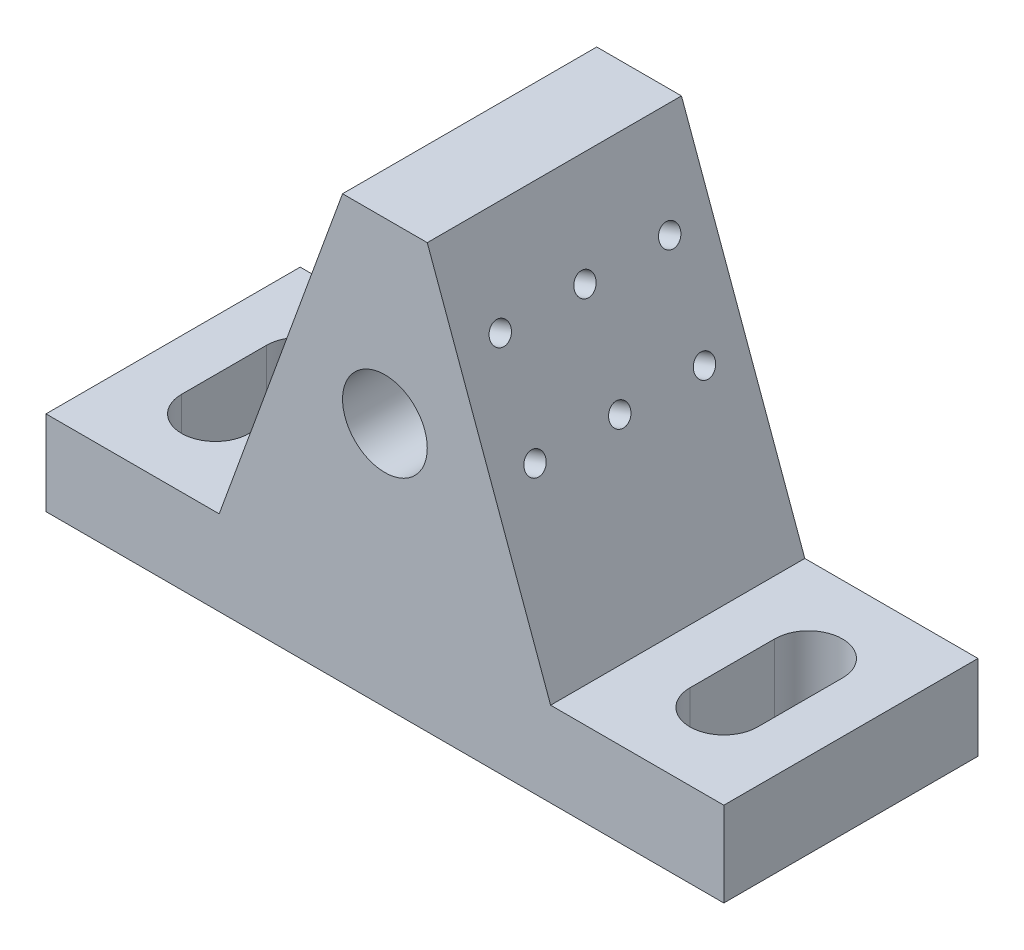
ISO-10303-21;
HEADER;
FILE_DESCRIPTION(('STEP AP214'),'2;1');
FILE_NAME('part.step','',(''),(''),'','','');
FILE_SCHEMA(('AUTOMOTIVE_DESIGN { 1 0 10303 214 1 1 1 1 }'));
ENDSEC;
DATA;
#1=APPLICATION_CONTEXT('core data for automotive mechanical design processes');
#2=APPLICATION_PROTOCOL_DEFINITION('international standard','automotive_design',2000,#1);
#3=PRODUCT_CONTEXT('',#1,'mechanical');
#4=PRODUCT('Part','Part','',(#3));
#5=PRODUCT_RELATED_PRODUCT_CATEGORY('part','',(#4));
#6=PRODUCT_DEFINITION_FORMATION('','',#4);
#7=PRODUCT_DEFINITION_CONTEXT('part definition',#1,'design');
#8=PRODUCT_DEFINITION('design','',#6,#7);
#9=PRODUCT_DEFINITION_SHAPE('','',#8);
#10=(LENGTH_UNIT() NAMED_UNIT(*) SI_UNIT(.MILLI.,.METRE.));
#11=(NAMED_UNIT(*) PLANE_ANGLE_UNIT() SI_UNIT($,.RADIAN.));
#12=(NAMED_UNIT(*) SI_UNIT($,.STERADIAN.) SOLID_ANGLE_UNIT());
#13=UNCERTAINTY_MEASURE_WITH_UNIT(LENGTH_MEASURE(1.E-05),#10,'distance_accuracy_value','');
#14=(GEOMETRIC_REPRESENTATION_CONTEXT(3) GLOBAL_UNCERTAINTY_ASSIGNED_CONTEXT((#13)) GLOBAL_UNIT_ASSIGNED_CONTEXT((#10,
#11,#12)) REPRESENTATION_CONTEXT('',''));
#15=CARTESIAN_POINT('',(0.,0.,0.));
#16=DIRECTION('',(0.,0.,1.));
#17=DIRECTION('',(1.,0.,0.));
#18=AXIS2_PLACEMENT_3D('',#15,#16,#17);
#19=CARTESIAN_POINT('',(40.,10.,15.));
#20=DIRECTION('',(0.,-1.,0.));
#21=DIRECTION('',(1.,0.,0.));
#22=AXIS2_PLACEMENT_3D('',#19,#20,#21);
#23=PLANE('',#22);
#24=DIRECTION('',(-1.,0.,0.));
#25=VECTOR('',#24,1.);
#26=CARTESIAN_POINT('',(40.,10.,-15.));
#27=LINE('',#26,#25);
#28=CARTESIAN_POINT('',(40.,10.,-15.));
#29=VERTEX_POINT('',#28);
#30=CARTESIAN_POINT('',(19.558809370648,10.,-15.));
#31=VERTEX_POINT('',#30);
#32=EDGE_CURVE('E290',#29,#31,#27,.T.);
#33=ORIENTED_EDGE('',*,*,#32,.T.);
#34=DIRECTION('',(0.,0.,-1.));
#35=VECTOR('',#34,1.);
#36=CARTESIAN_POINT('',(19.558809370648,10.,15.));
#37=LINE('',#36,#35);
#38=CARTESIAN_POINT('',(19.558809370648,10.,15.));
#39=VERTEX_POINT('',#38);
#40=EDGE_CURVE('E320',#39,#31,#37,.T.);
#41=ORIENTED_EDGE('',*,*,#40,.F.);
#42=DIRECTION('',(-1.,0.,0.));
#43=VECTOR('',#42,1.);
#44=CARTESIAN_POINT('',(40.,10.,15.));
#45=LINE('',#44,#43);
#46=CARTESIAN_POINT('',(40.,10.,15.));
#47=VERTEX_POINT('',#46);
#48=EDGE_CURVE('E272',#47,#39,#45,.T.);
#49=ORIENTED_EDGE('',*,*,#48,.F.);
#50=DIRECTION('',(0.,0.,-1.));
#51=VECTOR('',#50,1.);
#52=CARTESIAN_POINT('',(40.,10.,15.));
#53=LINE('',#52,#51);
#54=EDGE_CURVE('E323',#47,#29,#53,.T.);
#55=ORIENTED_EDGE('',*,*,#54,.T.);
#56=EDGE_LOOP('',(#33,#41,#49,#55));
#57=FACE_BOUND('',#56,.T.);
#58=CARTESIAN_POINT('',(30.,10.,5.));
#59=DIRECTION('',(0.,-1.,0.));
#60=DIRECTION('',(1.,0.,0.));
#61=AXIS2_PLACEMENT_3D('',#58,#59,#60);
#62=CIRCLE('',#61,4.);
#63=CARTESIAN_POINT('',(26.,9.99999999999999,5.));
#64=VERTEX_POINT('',#63);
#65=CARTESIAN_POINT('',(34.,10.,5.));
#66=VERTEX_POINT('',#65);
#67=EDGE_CURVE('E266',#64,#66,#62,.F.);
#68=ORIENTED_EDGE('',*,*,#67,.F.);
#69=DIRECTION('',(0.,0.,1.));
#70=VECTOR('',#69,1.);
#71=CARTESIAN_POINT('',(26.,10.,15.));
#72=LINE('',#71,#70);
#73=CARTESIAN_POINT('',(26.,10.,-5.));
#74=VERTEX_POINT('',#73);
#75=EDGE_CURVE('E259',#74,#64,#72,.T.);
#76=ORIENTED_EDGE('',*,*,#75,.F.);
#77=CARTESIAN_POINT('',(30.,10.,-5.));
#78=DIRECTION('',(0.,-1.,0.));
#79=DIRECTION('',(1.,0.,0.));
#80=AXIS2_PLACEMENT_3D('',#77,#78,#79);
#81=CIRCLE('',#80,4.);
#82=CARTESIAN_POINT('',(34.,10.,-5.));
#83=VERTEX_POINT('',#82);
#84=EDGE_CURVE('E261',#83,#74,#81,.F.);
#85=ORIENTED_EDGE('',*,*,#84,.F.);
#86=DIRECTION('',(0.,0.,-1.));
#87=VECTOR('',#86,1.);
#88=CARTESIAN_POINT('',(34.,10.,15.));
#89=LINE('',#88,#87);
#90=EDGE_CURVE('E264',#66,#83,#89,.T.);
#91=ORIENTED_EDGE('',*,*,#90,.F.);
#92=EDGE_LOOP('',(#68,#76,#85,#91));
#93=FACE_BOUND('',#92,.T.);
#94=ADVANCED_FACE('F41',(#57,#93),#23,.F.);
#95=CARTESIAN_POINT('',(-40.,0.,15.));
#96=DIRECTION('',(0.,1.,0.));
#97=DIRECTION('',(0.,0.,1.));
#98=AXIS2_PLACEMENT_3D('',#95,#96,#97);
#99=PLANE('',#98);
#100=DIRECTION('',(0.,0.,-1.));
#101=VECTOR('',#100,1.);
#102=CARTESIAN_POINT('',(-34.,0.,5.));
#103=LINE('',#102,#101);
#104=CARTESIAN_POINT('',(-34.,0.,5.));
#105=VERTEX_POINT('',#104);
#106=CARTESIAN_POINT('',(-34.,0.,-5.));
#107=VERTEX_POINT('',#106);
#108=EDGE_CURVE('E229',#105,#107,#103,.T.);
#109=ORIENTED_EDGE('',*,*,#108,.F.);
#110=CARTESIAN_POINT('',(-30.,0.,5.));
#111=DIRECTION('',(0.,-1.,0.));
#112=DIRECTION('',(0.,0.,1.));
#113=AXIS2_PLACEMENT_3D('',#110,#111,#112);
#114=CIRCLE('',#113,4.);
#115=CARTESIAN_POINT('',(-26.,0.,5.));
#116=VERTEX_POINT('',#115);
#117=EDGE_CURVE('E56',#116,#105,#114,.T.);
#118=ORIENTED_EDGE('',*,*,#117,.F.);
#119=DIRECTION('',(0.,0.,1.));
#120=VECTOR('',#119,1.);
#121=CARTESIAN_POINT('',(-26.,0.,5.));
#122=LINE('',#121,#120);
#123=CARTESIAN_POINT('',(-26.,0.,-5.));
#124=VERTEX_POINT('',#123);
#125=EDGE_CURVE('E223',#124,#116,#122,.T.);
#126=ORIENTED_EDGE('',*,*,#125,.F.);
#127=CARTESIAN_POINT('',(-30.,0.,-5.));
#128=DIRECTION('',(0.,-1.,0.));
#129=DIRECTION('',(0.,0.,1.));
#130=AXIS2_PLACEMENT_3D('',#127,#128,#129);
#131=CIRCLE('',#130,4.);
#132=EDGE_CURVE('E226',#107,#124,#131,.T.);
#133=ORIENTED_EDGE('',*,*,#132,.F.);
#134=EDGE_LOOP('',(#109,#118,#126,#133));
#135=FACE_BOUND('',#134,.T.);
#136=DIRECTION('',(1.,0.,0.));
#137=VECTOR('',#136,1.);
#138=CARTESIAN_POINT('',(-40.,0.,-15.));
#139=LINE('',#138,#137);
#140=CARTESIAN_POINT('',(-40.,0.,-15.));
#141=VERTEX_POINT('',#140);
#142=CARTESIAN_POINT('',(40.,0.,-15.));
#143=VERTEX_POINT('',#142);
#144=EDGE_CURVE('E273',#141,#143,#139,.T.);
#145=ORIENTED_EDGE('',*,*,#144,.T.);
#146=DIRECTION('',(0.,0.,-1.));
#147=VECTOR('',#146,1.);
#148=CARTESIAN_POINT('',(40.,0.,15.));
#149=LINE('',#148,#147);
#150=CARTESIAN_POINT('',(40.,0.,15.));
#151=VERTEX_POINT('',#150);
#152=EDGE_CURVE('E287',#151,#143,#149,.T.);
#153=ORIENTED_EDGE('',*,*,#152,.F.);
#154=DIRECTION('',(1.,0.,0.));
#155=VECTOR('',#154,1.);
#156=CARTESIAN_POINT('',(-40.,0.,15.));
#157=LINE('',#156,#155);
#158=CARTESIAN_POINT('',(-40.,0.,15.));
#159=VERTEX_POINT('',#158);
#160=EDGE_CURVE('E285',#159,#151,#157,.T.);
#161=ORIENTED_EDGE('',*,*,#160,.F.);
#162=DIRECTION('',(0.,0.,-1.));
#163=VECTOR('',#162,1.);
#164=CARTESIAN_POINT('',(-40.,0.,15.));
#165=LINE('',#164,#163);
#166=EDGE_CURVE('E305',#159,#141,#165,.T.);
#167=ORIENTED_EDGE('',*,*,#166,.T.);
#168=EDGE_LOOP('',(#145,#153,#161,#167));
#169=FACE_BOUND('',#168,.T.);
#170=CARTESIAN_POINT('',(30.,0.,5.));
#171=DIRECTION('',(0.,1.,0.));
#172=DIRECTION('',(0.,0.,1.));
#173=AXIS2_PLACEMENT_3D('',#170,#171,#172);
#174=CIRCLE('',#173,4.);
#175=CARTESIAN_POINT('',(26.,0.,5.));
#176=VERTEX_POINT('',#175);
#177=CARTESIAN_POINT('',(34.,0.,5.));
#178=VERTEX_POINT('',#177);
#179=EDGE_CURVE('E238',#176,#178,#174,.T.);
#180=ORIENTED_EDGE('',*,*,#179,.T.);
#181=DIRECTION('',(0.,0.,-1.));
#182=VECTOR('',#181,1.);
#183=CARTESIAN_POINT('',(34.,0.,5.));
#184=LINE('',#183,#182);
#185=CARTESIAN_POINT('',(34.,0.,-5.));
#186=VERTEX_POINT('',#185);
#187=EDGE_CURVE('E241',#178,#186,#184,.T.);
#188=ORIENTED_EDGE('',*,*,#187,.T.);
#189=CARTESIAN_POINT('',(30.,0.,-5.));
#190=DIRECTION('',(0.,1.,0.));
#191=DIRECTION('',(0.,0.,1.));
#192=AXIS2_PLACEMENT_3D('',#189,#190,#191);
#193=CIRCLE('',#192,4.);
#194=CARTESIAN_POINT('',(26.,0.,-5.));
#195=VERTEX_POINT('',#194);
#196=EDGE_CURVE('E244',#186,#195,#193,.T.);
#197=ORIENTED_EDGE('',*,*,#196,.T.);
#198=DIRECTION('',(0.,0.,1.));
#199=VECTOR('',#198,1.);
#200=CARTESIAN_POINT('',(26.,0.,5.));
#201=LINE('',#200,#199);
#202=EDGE_CURVE('E247',#195,#176,#201,.T.);
#203=ORIENTED_EDGE('',*,*,#202,.T.);
#204=EDGE_LOOP('',(#180,#188,#197,#203));
#205=FACE_BOUND('',#204,.T.);
#206=ADVANCED_FACE('F345',(#135,#169,#205),#99,.F.);
#207=CARTESIAN_POINT('',(40.,0.,15.));
#208=DIRECTION('',(-1.,0.,0.));
#209=DIRECTION('',(0.,0.,1.));
#210=AXIS2_PLACEMENT_3D('',#207,#208,#209);
#211=PLANE('',#210);
#212=DIRECTION('',(0.,1.,0.));
#213=VECTOR('',#212,1.);
#214=CARTESIAN_POINT('',(40.,0.,-15.));
#215=LINE('',#214,#213);
#216=EDGE_CURVE('E268',#143,#29,#215,.T.);
#217=ORIENTED_EDGE('',*,*,#216,.T.);
#218=ORIENTED_EDGE('',*,*,#54,.F.);
#219=DIRECTION('',(0.,1.,0.));
#220=VECTOR('',#219,1.);
#221=CARTESIAN_POINT('',(40.,0.,15.));
#222=LINE('',#221,#220);
#223=EDGE_CURVE('E269',#151,#47,#222,.T.);
#224=ORIENTED_EDGE('',*,*,#223,.F.);
#225=ORIENTED_EDGE('',*,*,#152,.T.);
#226=EDGE_LOOP('',(#217,#218,#224,#225));
#227=FACE_BOUND('',#226,.T.);
#228=ADVANCED_FACE('F43',(#227),#211,.F.);
#229=CARTESIAN_POINT('',(19.558809370648,10.,15.));
#230=DIRECTION('',(-0.939692620785909,-0.342020143325666,0.));
#231=DIRECTION('',(0.342020143325666,-0.939692620785909,0.));
#232=AXIS2_PLACEMENT_3D('',#229,#230,#231);
#233=PLANE('',#232);
#234=CARTESIAN_POINT('',(8.61416478422666,40.0701638651491,-10.));
#235=DIRECTION('',(0.939692620785909,0.342020143325666,0.));
#236=DIRECTION('',(-0.342020143325666,0.939692620785909,0.));
#237=AXIS2_PLACEMENT_3D('',#234,#235,#236);
#238=CIRCLE('',#237,1.24999999999999);
#239=CARTESIAN_POINT('',(8.18663960506958,41.2447796411315,-10.));
#240=VERTEX_POINT('',#239);
#241=EDGE_CURVE('E182',#240,#240,#238,.T.);
#242=ORIENTED_EDGE('',*,*,#241,.F.);
#243=EDGE_LOOP('',(#242));
#244=FACE_BOUND('',#243,.T.);
#245=CARTESIAN_POINT('',(12.7184065041347,28.7938524157182,-10.));
#246=DIRECTION('',(0.939692620785909,0.342020143325666,0.));
#247=DIRECTION('',(-0.342020143325666,0.939692620785909,0.));
#248=AXIS2_PLACEMENT_3D('',#245,#246,#247);
#249=CIRCLE('',#248,1.24999999999999);
#250=CARTESIAN_POINT('',(12.2908813249776,29.9684681917006,-10.));
#251=VERTEX_POINT('',#250);
#252=EDGE_CURVE('E181',#251,#251,#249,.T.);
#253=ORIENTED_EDGE('',*,*,#252,.F.);
#254=EDGE_LOOP('',(#253));
#255=FACE_BOUND('',#254,.T.);
#256=CARTESIAN_POINT('',(8.61416478422666,40.0701638651491,0.));
#257=DIRECTION('',(0.939692620785909,0.342020143325666,0.));
#258=DIRECTION('',(-0.342020143325666,0.939692620785909,0.));
#259=AXIS2_PLACEMENT_3D('',#256,#257,#258);
#260=CIRCLE('',#259,1.24999999999999);
#261=CARTESIAN_POINT('',(8.18663960506958,41.2447796411315,0.));
#262=VERTEX_POINT('',#261);
#263=EDGE_CURVE('E192',#262,#262,#260,.T.);
#264=ORIENTED_EDGE('',*,*,#263,.F.);
#265=EDGE_LOOP('',(#264));
#266=FACE_BOUND('',#265,.T.);
#267=CARTESIAN_POINT('',(12.7184065041347,28.7938524157182,0.));
#268=DIRECTION('',(0.939692620785909,0.342020143325666,0.));
#269=DIRECTION('',(-0.342020143325666,0.939692620785909,0.));
#270=AXIS2_PLACEMENT_3D('',#267,#268,#269);
#271=CIRCLE('',#270,1.24999999999999);
#272=CARTESIAN_POINT('',(12.2908813249776,29.9684681917006,0.));
#273=VERTEX_POINT('',#272);
#274=EDGE_CURVE('E198',#273,#273,#271,.T.);
#275=ORIENTED_EDGE('',*,*,#274,.F.);
#276=EDGE_LOOP('',(#275));
#277=FACE_BOUND('',#276,.T.);
#278=CARTESIAN_POINT('',(8.61416478422666,40.0701638651491,10.));
#279=DIRECTION('',(0.939692620785909,0.342020143325666,0.));
#280=DIRECTION('',(-0.342020143325666,0.939692620785909,0.));
#281=AXIS2_PLACEMENT_3D('',#278,#279,#280);
#282=CIRCLE('',#281,1.24999999999999);
#283=CARTESIAN_POINT('',(8.18663960506958,41.2447796411315,10.));
#284=VERTEX_POINT('',#283);
#285=EDGE_CURVE('E204',#284,#284,#282,.T.);
#286=ORIENTED_EDGE('',*,*,#285,.F.);
#287=EDGE_LOOP('',(#286));
#288=FACE_BOUND('',#287,.T.);
#289=CARTESIAN_POINT('',(12.7184065041347,28.7938524157182,10.));
#290=DIRECTION('',(0.939692620785909,0.342020143325666,0.));
#291=DIRECTION('',(-0.342020143325666,0.939692620785909,0.));
#292=AXIS2_PLACEMENT_3D('',#289,#290,#291);
#293=CIRCLE('',#292,1.24999999999999);
#294=CARTESIAN_POINT('',(12.2908813249776,29.9684681917006,10.));
#295=VERTEX_POINT('',#294);
#296=EDGE_CURVE('E210',#295,#295,#293,.T.);
#297=ORIENTED_EDGE('',*,*,#296,.F.);
#298=EDGE_LOOP('',(#297));
#299=FACE_BOUND('',#298,.T.);
#300=DIRECTION('',(-0.342020143325666,0.939692620785909,0.));
#301=VECTOR('',#300,1.);
#302=CARTESIAN_POINT('',(19.558809370648,10.,-15.));
#303=LINE('',#302,#301);
#304=CARTESIAN_POINT('',(5.,50.,-15.));
#305=VERTEX_POINT('',#304);
#306=EDGE_CURVE('E292',#31,#305,#303,.T.);
#307=ORIENTED_EDGE('',*,*,#306,.T.);
#308=DIRECTION('',(0.,0.,-1.));
#309=VECTOR('',#308,1.);
#310=CARTESIAN_POINT('',(5.,50.,15.));
#311=LINE('',#310,#309);
#312=CARTESIAN_POINT('',(5.,50.,15.));
#313=VERTEX_POINT('',#312);
#314=EDGE_CURVE('E317',#313,#305,#311,.T.);
#315=ORIENTED_EDGE('',*,*,#314,.F.);
#316=DIRECTION('',(-0.342020143325666,0.939692620785909,0.));
#317=VECTOR('',#316,1.);
#318=CARTESIAN_POINT('',(19.558809370648,10.,15.));
#319=LINE('',#318,#317);
#320=EDGE_CURVE('E275',#39,#313,#319,.T.);
#321=ORIENTED_EDGE('',*,*,#320,.F.);
#322=ORIENTED_EDGE('',*,*,#40,.T.);
#323=EDGE_LOOP('',(#307,#315,#321,#322));
#324=FACE_BOUND('',#323,.T.);
#325=ADVANCED_FACE('F368',(#244,#255,#266,#277,#288,#299,#324),#233,.F.);
#326=CARTESIAN_POINT('',(5.,50.,15.));
#327=DIRECTION('',(0.,-1.,0.));
#328=DIRECTION('',(0.,0.,-1.));
#329=AXIS2_PLACEMENT_3D('',#326,#327,#328);
#330=PLANE('',#329);
#331=DIRECTION('',(-1.,0.,0.));
#332=VECTOR('',#331,1.);
#333=CARTESIAN_POINT('',(5.,50.,-15.));
#334=LINE('',#333,#332);
#335=CARTESIAN_POINT('',(-5.,50.,-15.));
#336=VERTEX_POINT('',#335);
#337=EDGE_CURVE('E294',#305,#336,#334,.T.);
#338=ORIENTED_EDGE('',*,*,#337,.T.);
#339=DIRECTION('',(0.,0.,-1.));
#340=VECTOR('',#339,1.);
#341=CARTESIAN_POINT('',(-5.,50.,15.));
#342=LINE('',#341,#340);
#343=CARTESIAN_POINT('',(-5.,50.,15.));
#344=VERTEX_POINT('',#343);
#345=EDGE_CURVE('E314',#344,#336,#342,.T.);
#346=ORIENTED_EDGE('',*,*,#345,.F.);
#347=DIRECTION('',(-1.,0.,0.));
#348=VECTOR('',#347,1.);
#349=CARTESIAN_POINT('',(5.,50.,15.));
#350=LINE('',#349,#348);
#351=EDGE_CURVE('E277',#313,#344,#350,.T.);
#352=ORIENTED_EDGE('',*,*,#351,.F.);
#353=ORIENTED_EDGE('',*,*,#314,.T.);
#354=EDGE_LOOP('',(#338,#346,#352,#353));
#355=FACE_BOUND('',#354,.T.);
#356=ADVANCED_FACE('F371',(#355),#330,.F.);
#357=CARTESIAN_POINT('',(-19.558809370648,10.,15.));
#358=DIRECTION('',(0.939692620785909,-0.342020143325666,0.));
#359=DIRECTION('',(0.342020143325666,0.939692620785909,0.));
#360=AXIS2_PLACEMENT_3D('',#357,#358,#359);
#361=PLANE('',#360);
#362=DIRECTION('',(-0.342020143325666,-0.939692620785909,0.));
#363=VECTOR('',#362,1.);
#364=CARTESIAN_POINT('',(-19.558809370648,10.,-15.));
#365=LINE('',#364,#363);
#366=CARTESIAN_POINT('',(-19.558809370648,10.,-15.));
#367=VERTEX_POINT('',#366);
#368=EDGE_CURVE('E296',#336,#367,#365,.T.);
#369=ORIENTED_EDGE('',*,*,#368,.T.);
#370=DIRECTION('',(0.,0.,-1.));
#371=VECTOR('',#370,1.);
#372=CARTESIAN_POINT('',(-19.558809370648,10.,15.));
#373=LINE('',#372,#371);
#374=CARTESIAN_POINT('',(-19.558809370648,10.,15.));
#375=VERTEX_POINT('',#374);
#376=EDGE_CURVE('E311',#375,#367,#373,.T.);
#377=ORIENTED_EDGE('',*,*,#376,.F.);
#378=DIRECTION('',(-0.342020143325666,-0.939692620785909,0.));
#379=VECTOR('',#378,1.);
#380=CARTESIAN_POINT('',(-19.558809370648,10.,15.));
#381=LINE('',#380,#379);
#382=EDGE_CURVE('E279',#344,#375,#381,.T.);
#383=ORIENTED_EDGE('',*,*,#382,.F.);
#384=ORIENTED_EDGE('',*,*,#345,.T.);
#385=EDGE_LOOP('',(#369,#377,#383,#384));
#386=FACE_BOUND('',#385,.T.);
#387=ADVANCED_FACE('F375',(#386),#361,.F.);
#388=CARTESIAN_POINT('',(-40.,10.,15.));
#389=DIRECTION('',(0.,-1.,0.));
#390=DIRECTION('',(1.,0.,0.));
#391=AXIS2_PLACEMENT_3D('',#388,#389,#390);
#392=PLANE('',#391);
#393=DIRECTION('',(0.,0.,1.));
#394=VECTOR('',#393,1.);
#395=CARTESIAN_POINT('',(-26.,10.,15.));
#396=LINE('',#395,#394);
#397=CARTESIAN_POINT('',(-26.,10.,-5.));
#398=VERTEX_POINT('',#397);
#399=CARTESIAN_POINT('',(-26.,9.99999999999999,5.));
#400=VERTEX_POINT('',#399);
#401=EDGE_CURVE('E49',#398,#400,#396,.T.);
#402=ORIENTED_EDGE('',*,*,#401,.T.);
#403=CARTESIAN_POINT('',(-30.,10.,5.));
#404=DIRECTION('',(0.,-1.,0.));
#405=DIRECTION('',(1.,0.,0.));
#406=AXIS2_PLACEMENT_3D('',#403,#404,#405);
#407=CIRCLE('',#406,4.);
#408=CARTESIAN_POINT('',(-34.,10.,5.));
#409=VERTEX_POINT('',#408);
#410=EDGE_CURVE('E11',#400,#409,#407,.T.);
#411=ORIENTED_EDGE('',*,*,#410,.T.);
#412=DIRECTION('',(0.,0.,-1.));
#413=VECTOR('',#412,1.);
#414=CARTESIAN_POINT('',(-34.,10.,15.));
#415=LINE('',#414,#413);
#416=CARTESIAN_POINT('',(-34.,10.,-5.));
#417=VERTEX_POINT('',#416);
#418=EDGE_CURVE('E326',#409,#417,#415,.T.);
#419=ORIENTED_EDGE('',*,*,#418,.T.);
#420=CARTESIAN_POINT('',(-30.,10.,-5.));
#421=DIRECTION('',(0.,-1.,0.));
#422=DIRECTION('',(1.,0.,0.));
#423=AXIS2_PLACEMENT_3D('',#420,#421,#422);
#424=CIRCLE('',#423,4.);
#425=EDGE_CURVE('E329',#417,#398,#424,.T.);
#426=ORIENTED_EDGE('',*,*,#425,.T.);
#427=EDGE_LOOP('',(#402,#411,#419,#426));
#428=FACE_BOUND('',#427,.T.);
#429=DIRECTION('',(-1.,0.,0.));
#430=VECTOR('',#429,1.);
#431=CARTESIAN_POINT('',(-40.,10.,-15.));
#432=LINE('',#431,#430);
#433=CARTESIAN_POINT('',(-40.,10.,-15.));
#434=VERTEX_POINT('',#433);
#435=EDGE_CURVE('E298',#367,#434,#432,.T.);
#436=ORIENTED_EDGE('',*,*,#435,.T.);
#437=DIRECTION('',(0.,0.,-1.));
#438=VECTOR('',#437,1.);
#439=CARTESIAN_POINT('',(-40.,10.,15.));
#440=LINE('',#439,#438);
#441=CARTESIAN_POINT('',(-40.,10.,15.));
#442=VERTEX_POINT('',#441);
#443=EDGE_CURVE('E308',#442,#434,#440,.T.);
#444=ORIENTED_EDGE('',*,*,#443,.F.);
#445=DIRECTION('',(-1.,0.,0.));
#446=VECTOR('',#445,1.);
#447=CARTESIAN_POINT('',(-40.,10.,15.));
#448=LINE('',#447,#446);
#449=EDGE_CURVE('E281',#375,#442,#448,.T.);
#450=ORIENTED_EDGE('',*,*,#449,.F.);
#451=ORIENTED_EDGE('',*,*,#376,.T.);
#452=EDGE_LOOP('',(#436,#444,#450,#451));
#453=FACE_BOUND('',#452,.T.);
#454=ADVANCED_FACE('F333',(#428,#453),#392,.F.);
#455=CARTESIAN_POINT('',(-40.,0.,15.));
#456=DIRECTION('',(1.,0.,0.));
#457=DIRECTION('',(0.,0.,-1.));
#458=AXIS2_PLACEMENT_3D('',#455,#456,#457);
#459=PLANE('',#458);
#460=DIRECTION('',(0.,-1.,0.));
#461=VECTOR('',#460,1.);
#462=CARTESIAN_POINT('',(-40.,0.,-15.));
#463=LINE('',#462,#461);
#464=EDGE_CURVE('E300',#434,#141,#463,.T.);
#465=ORIENTED_EDGE('',*,*,#464,.T.);
#466=ORIENTED_EDGE('',*,*,#166,.F.);
#467=DIRECTION('',(0.,-1.,0.));
#468=VECTOR('',#467,1.);
#469=CARTESIAN_POINT('',(-40.,0.,15.));
#470=LINE('',#469,#468);
#471=EDGE_CURVE('E283',#442,#159,#470,.T.);
#472=ORIENTED_EDGE('',*,*,#471,.F.);
#473=ORIENTED_EDGE('',*,*,#443,.T.);
#474=EDGE_LOOP('',(#465,#466,#472,#473));
#475=FACE_BOUND('',#474,.T.);
#476=ADVANCED_FACE('F382',(#475),#459,.F.);
#477=CARTESIAN_POINT('',(0.,0.,15.));
#478=DIRECTION('',(0.,0.,1.));
#479=DIRECTION('',(1.,0.,0.));
#480=AXIS2_PLACEMENT_3D('',#477,#478,#479);
#481=PLANE('',#480);
#482=CARTESIAN_POINT('',(0.,29.,15.));
#483=DIRECTION('',(0.,0.,1.));
#484=DIRECTION('',(1.,0.,0.));
#485=AXIS2_PLACEMENT_3D('',#482,#483,#484);
#486=CIRCLE('',#485,5.);
#487=CARTESIAN_POINT('',(5.,29.,15.));
#488=VERTEX_POINT('',#487);
#489=EDGE_CURVE('E216',#488,#488,#486,.T.);
#490=ORIENTED_EDGE('',*,*,#489,.F.);
#491=EDGE_LOOP('',(#490));
#492=FACE_BOUND('',#491,.T.);
#493=ORIENTED_EDGE('',*,*,#223,.T.);
#494=ORIENTED_EDGE('',*,*,#48,.T.);
#495=ORIENTED_EDGE('',*,*,#320,.T.);
#496=ORIENTED_EDGE('',*,*,#351,.T.);
#497=ORIENTED_EDGE('',*,*,#382,.T.);
#498=ORIENTED_EDGE('',*,*,#449,.T.);
#499=ORIENTED_EDGE('',*,*,#471,.T.);
#500=ORIENTED_EDGE('',*,*,#160,.T.);
#501=EDGE_LOOP('',(#493,#494,#495,#496,#497,#498,#499,#500));
#502=FACE_BOUND('',#501,.T.);
#503=ADVANCED_FACE('F384',(#492,#502),#481,.T.);
#504=CARTESIAN_POINT('',(0.,0.,-15.));
#505=DIRECTION('',(0.,0.,1.));
#506=DIRECTION('',(1.,0.,0.));
#507=AXIS2_PLACEMENT_3D('',#504,#505,#506);
#508=PLANE('',#507);
#509=CARTESIAN_POINT('',(0.,29.,-15.));
#510=DIRECTION('',(0.,0.,1.));
#511=DIRECTION('',(1.,0.,0.));
#512=AXIS2_PLACEMENT_3D('',#509,#510,#511);
#513=CIRCLE('',#512,5.);
#514=CARTESIAN_POINT('',(5.,29.,-15.));
#515=VERTEX_POINT('',#514);
#516=EDGE_CURVE('E217',#515,#515,#513,.T.);
#517=ORIENTED_EDGE('',*,*,#516,.T.);
#518=EDGE_LOOP('',(#517));
#519=FACE_BOUND('',#518,.T.);
#520=ORIENTED_EDGE('',*,*,#216,.F.);
#521=ORIENTED_EDGE('',*,*,#144,.F.);
#522=ORIENTED_EDGE('',*,*,#464,.F.);
#523=ORIENTED_EDGE('',*,*,#435,.F.);
#524=ORIENTED_EDGE('',*,*,#368,.F.);
#525=ORIENTED_EDGE('',*,*,#337,.F.);
#526=ORIENTED_EDGE('',*,*,#306,.F.);
#527=ORIENTED_EDGE('',*,*,#32,.F.);
#528=EDGE_LOOP('',(#520,#521,#522,#523,#524,#525,#526,#527));
#529=FACE_BOUND('',#528,.T.);
#530=ADVANCED_FACE('F387',(#519,#529),#508,.F.);
#531=CARTESIAN_POINT('',(30.,50.,5.));
#532=DIRECTION('',(0.,-1.,0.));
#533=DIRECTION('',(0.,0.,-1.));
#534=AXIS2_PLACEMENT_3D('',#531,#532,#533);
#535=CYLINDRICAL_SURFACE('',#534,4.);
#536=ORIENTED_EDGE('',*,*,#67,.T.);
#537=DIRECTION('',(0.,-1.,0.));
#538=VECTOR('',#537,1.);
#539=CARTESIAN_POINT('',(34.,50.,5.));
#540=LINE('',#539,#538);
#541=EDGE_CURVE('E257',#66,#178,#540,.T.);
#542=ORIENTED_EDGE('',*,*,#541,.T.);
#543=ORIENTED_EDGE('',*,*,#179,.F.);
#544=DIRECTION('',(0.,-1.,0.));
#545=VECTOR('',#544,1.);
#546=CARTESIAN_POINT('',(26.,50.,5.));
#547=LINE('',#546,#545);
#548=EDGE_CURVE('E250',#64,#176,#547,.T.);
#549=ORIENTED_EDGE('',*,*,#548,.F.);
#550=EDGE_LOOP('',(#536,#542,#543,#549));
#551=FACE_BOUND('',#550,.T.);
#552=ADVANCED_FACE('F390',(#551),#535,.F.);
#553=CARTESIAN_POINT('',(34.,50.,5.));
#554=DIRECTION('',(-1.,0.,0.));
#555=DIRECTION('',(0.,0.,1.));
#556=AXIS2_PLACEMENT_3D('',#553,#554,#555);
#557=PLANE('',#556);
#558=ORIENTED_EDGE('',*,*,#90,.T.);
#559=DIRECTION('',(0.,-1.,0.));
#560=VECTOR('',#559,1.);
#561=CARTESIAN_POINT('',(34.,50.,-5.));
#562=LINE('',#561,#560);
#563=EDGE_CURVE('E255',#83,#186,#562,.T.);
#564=ORIENTED_EDGE('',*,*,#563,.T.);
#565=ORIENTED_EDGE('',*,*,#187,.F.);
#566=ORIENTED_EDGE('',*,*,#541,.F.);
#567=EDGE_LOOP('',(#558,#564,#565,#566));
#568=FACE_BOUND('',#567,.T.);
#569=ADVANCED_FACE('F397',(#568),#557,.T.);
#570=CARTESIAN_POINT('',(30.,50.,-5.));
#571=DIRECTION('',(0.,-1.,0.));
#572=DIRECTION('',(0.,0.,-1.));
#573=AXIS2_PLACEMENT_3D('',#570,#571,#572);
#574=CYLINDRICAL_SURFACE('',#573,4.);
#575=ORIENTED_EDGE('',*,*,#84,.T.);
#576=DIRECTION('',(0.,-1.,0.));
#577=VECTOR('',#576,1.);
#578=CARTESIAN_POINT('',(26.,50.,-5.));
#579=LINE('',#578,#577);
#580=EDGE_CURVE('E253',#74,#195,#579,.T.);
#581=ORIENTED_EDGE('',*,*,#580,.T.);
#582=ORIENTED_EDGE('',*,*,#196,.F.);
#583=ORIENTED_EDGE('',*,*,#563,.F.);
#584=EDGE_LOOP('',(#575,#581,#582,#583));
#585=FACE_BOUND('',#584,.T.);
#586=ADVANCED_FACE('F357',(#585),#574,.F.);
#587=CARTESIAN_POINT('',(26.,50.,5.));
#588=DIRECTION('',(1.,0.,0.));
#589=DIRECTION('',(0.,0.,-1.));
#590=AXIS2_PLACEMENT_3D('',#587,#588,#589);
#591=PLANE('',#590);
#592=ORIENTED_EDGE('',*,*,#75,.T.);
#593=ORIENTED_EDGE('',*,*,#548,.T.);
#594=ORIENTED_EDGE('',*,*,#202,.F.);
#595=ORIENTED_EDGE('',*,*,#580,.F.);
#596=EDGE_LOOP('',(#592,#593,#594,#595));
#597=FACE_BOUND('',#596,.T.);
#598=ADVANCED_FACE('F350',(#597),#591,.T.);
#599=CARTESIAN_POINT('',(-30.,50.,5.));
#600=DIRECTION('',(0.,-1.,0.));
#601=DIRECTION('',(0.,0.,-1.));
#602=AXIS2_PLACEMENT_3D('',#599,#600,#601);
#603=CYLINDRICAL_SURFACE('',#602,4.);
#604=DIRECTION('',(0.,-1.,0.));
#605=VECTOR('',#604,1.);
#606=CARTESIAN_POINT('',(-26.,50.,5.));
#607=LINE('',#606,#605);
#608=EDGE_CURVE('E236',#400,#116,#607,.T.);
#609=ORIENTED_EDGE('',*,*,#608,.T.);
#610=ORIENTED_EDGE('',*,*,#117,.T.);
#611=DIRECTION('',(0.,-1.,0.));
#612=VECTOR('',#611,1.);
#613=CARTESIAN_POINT('',(-34.,50.,5.));
#614=LINE('',#613,#612);
#615=EDGE_CURVE('E231',#409,#105,#614,.T.);
#616=ORIENTED_EDGE('',*,*,#615,.F.);
#617=ORIENTED_EDGE('',*,*,#410,.F.);
#618=EDGE_LOOP('',(#609,#610,#616,#617));
#619=FACE_BOUND('',#618,.T.);
#620=ADVANCED_FACE('F348',(#619),#603,.F.);
#621=CARTESIAN_POINT('',(-26.,50.,5.));
#622=DIRECTION('',(1.,0.,0.));
#623=DIRECTION('',(0.,0.,-1.));
#624=AXIS2_PLACEMENT_3D('',#621,#622,#623);
#625=PLANE('',#624);
#626=DIRECTION('',(0.,-1.,0.));
#627=VECTOR('',#626,1.);
#628=CARTESIAN_POINT('',(-26.,50.,-5.));
#629=LINE('',#628,#627);
#630=EDGE_CURVE('E234',#398,#124,#629,.T.);
#631=ORIENTED_EDGE('',*,*,#630,.T.);
#632=ORIENTED_EDGE('',*,*,#125,.T.);
#633=ORIENTED_EDGE('',*,*,#608,.F.);
#634=ORIENTED_EDGE('',*,*,#401,.F.);
#635=EDGE_LOOP('',(#631,#632,#633,#634));
#636=FACE_BOUND('',#635,.T.);
#637=ADVANCED_FACE('F338',(#636),#625,.F.);
#638=CARTESIAN_POINT('',(-30.,50.,-5.));
#639=DIRECTION('',(0.,-1.,0.));
#640=DIRECTION('',(0.,0.,-1.));
#641=AXIS2_PLACEMENT_3D('',#638,#639,#640);
#642=CYLINDRICAL_SURFACE('',#641,4.);
#643=DIRECTION('',(0.,-1.,0.));
#644=VECTOR('',#643,1.);
#645=CARTESIAN_POINT('',(-34.,50.,-5.));
#646=LINE('',#645,#644);
#647=EDGE_CURVE('E64',#417,#107,#646,.T.);
#648=ORIENTED_EDGE('',*,*,#647,.T.);
#649=ORIENTED_EDGE('',*,*,#132,.T.);
#650=ORIENTED_EDGE('',*,*,#630,.F.);
#651=ORIENTED_EDGE('',*,*,#425,.F.);
#652=EDGE_LOOP('',(#648,#649,#650,#651));
#653=FACE_BOUND('',#652,.T.);
#654=ADVANCED_FACE('F340',(#653),#642,.F.);
#655=CARTESIAN_POINT('',(-34.,50.,5.));
#656=DIRECTION('',(-1.,0.,0.));
#657=DIRECTION('',(0.,0.,1.));
#658=AXIS2_PLACEMENT_3D('',#655,#656,#657);
#659=PLANE('',#658);
#660=ORIENTED_EDGE('',*,*,#615,.T.);
#661=ORIENTED_EDGE('',*,*,#108,.T.);
#662=ORIENTED_EDGE('',*,*,#647,.F.);
#663=ORIENTED_EDGE('',*,*,#418,.F.);
#664=EDGE_LOOP('',(#660,#661,#662,#663));
#665=FACE_BOUND('',#664,.T.);
#666=ADVANCED_FACE('F347',(#665),#659,.F.);
#667=CARTESIAN_POINT('',(0.,29.,-15.));
#668=DIRECTION('',(0.,0.,1.));
#669=DIRECTION('',(1.,0.,0.));
#670=AXIS2_PLACEMENT_3D('',#667,#668,#669);
#671=CYLINDRICAL_SURFACE('',#670,5.);
#672=ORIENTED_EDGE('',*,*,#516,.F.);
#673=EDGE_LOOP('',(#672));
#674=FACE_BOUND('',#673,.T.);
#675=ORIENTED_EDGE('',*,*,#489,.T.);
#676=EDGE_LOOP('',(#675));
#677=FACE_BOUND('',#676,.T.);
#678=ADVANCED_FACE('F467',(#674,#677),#671,.F.);
#679=CARTESIAN_POINT('',(5.67071184824034,26.2287013407757,10.));
#680=DIRECTION('',(0.939692620785909,0.342020143325666,0.));
#681=DIRECTION('',(-0.342020143325666,0.939692620785909,0.));
#682=AXIS2_PLACEMENT_3D('',#679,#680,#681);
#683=CONICAL_SURFACE('',#682,1.24999999999999,1.02974425867664);
#684=CARTESIAN_POINT('',(4.96493148596402,25.9718182969775,10.));
#685=VERTEX_POINT('',#684);
#686=VERTEX_LOOP('',#685);
#687=FACE_BOUND('',#686,.T.);
#688=CARTESIAN_POINT('',(5.67071184824034,26.2287013407757,10.));
#689=DIRECTION('',(0.939692620785909,0.342020143325666,0.));
#690=DIRECTION('',(-0.342020143325666,0.939692620785909,0.));
#691=AXIS2_PLACEMENT_3D('',#688,#689,#690);
#692=CIRCLE('',#691,1.24999999999999);
#693=CARTESIAN_POINT('',(5.24318666908326,27.4033171167581,10.));
#694=VERTEX_POINT('',#693);
#695=EDGE_CURVE('E213',#694,#694,#692,.T.);
#696=ORIENTED_EDGE('',*,*,#695,.T.);
#697=EDGE_LOOP('',(#696));
#698=FACE_BOUND('',#697,.T.);
#699=ADVANCED_FACE('F487',(#687,#698),#683,.F.);
#700=CARTESIAN_POINT('',(12.7184065041347,28.7938524157182,10.));
#701=DIRECTION('',(0.939692620785909,0.342020143325666,0.));
#702=DIRECTION('',(-0.342020143325666,0.939692620785909,0.));
#703=AXIS2_PLACEMENT_3D('',#700,#701,#702);
#704=CYLINDRICAL_SURFACE('',#703,1.24999999999999);
#705=ORIENTED_EDGE('',*,*,#695,.F.);
#706=EDGE_LOOP('',(#705));
#707=FACE_BOUND('',#706,.T.);
#708=ORIENTED_EDGE('',*,*,#296,.T.);
#709=EDGE_LOOP('',(#708));
#710=FACE_BOUND('',#709,.T.);
#711=ADVANCED_FACE('F497',(#707,#710),#704,.F.);
#712=CARTESIAN_POINT('',(1.56647012833235,37.5050127902066,10.));
#713=DIRECTION('',(0.939692620785909,0.342020143325666,0.));
#714=DIRECTION('',(-0.342020143325666,0.939692620785909,0.));
#715=AXIS2_PLACEMENT_3D('',#712,#713,#714);
#716=CONICAL_SURFACE('',#715,1.24999999999999,1.02974425867664);
#717=CARTESIAN_POINT('',(0.860689766056024,37.2481297464084,10.));
#718=VERTEX_POINT('',#717);
#719=VERTEX_LOOP('',#718);
#720=FACE_BOUND('',#719,.T.);
#721=CARTESIAN_POINT('',(1.56647012833235,37.5050127902066,10.));
#722=DIRECTION('',(0.939692620785909,0.342020143325666,0.));
#723=DIRECTION('',(-0.342020143325666,0.939692620785909,0.));
#724=AXIS2_PLACEMENT_3D('',#721,#722,#723);
#725=CIRCLE('',#724,1.24999999999999);
#726=CARTESIAN_POINT('',(1.13894494917527,38.679628566189,10.));
#727=VERTEX_POINT('',#726);
#728=EDGE_CURVE('E207',#727,#727,#725,.T.);
#729=ORIENTED_EDGE('',*,*,#728,.T.);
#730=EDGE_LOOP('',(#729));
#731=FACE_BOUND('',#730,.T.);
#732=ADVANCED_FACE('F508',(#720,#731),#716,.F.);
#733=CARTESIAN_POINT('',(8.61416478422666,40.0701638651491,10.));
#734=DIRECTION('',(0.939692620785909,0.342020143325666,0.));
#735=DIRECTION('',(-0.342020143325666,0.939692620785909,0.));
#736=AXIS2_PLACEMENT_3D('',#733,#734,#735);
#737=CYLINDRICAL_SURFACE('',#736,1.24999999999999);
#738=ORIENTED_EDGE('',*,*,#728,.F.);
#739=EDGE_LOOP('',(#738));
#740=FACE_BOUND('',#739,.T.);
#741=ORIENTED_EDGE('',*,*,#285,.T.);
#742=EDGE_LOOP('',(#741));
#743=FACE_BOUND('',#742,.T.);
#744=ADVANCED_FACE('F531',(#740,#743),#737,.F.);
#745=CARTESIAN_POINT('',(5.67071184824034,26.2287013407757,0.));
#746=DIRECTION('',(0.939692620785909,0.342020143325666,0.));
#747=DIRECTION('',(-0.342020143325666,0.939692620785909,0.));
#748=AXIS2_PLACEMENT_3D('',#745,#746,#747);
#749=CONICAL_SURFACE('',#748,1.24999999999999,1.02974425867664);
#750=CARTESIAN_POINT('',(4.96493148596402,25.9718182969775,0.));
#751=VERTEX_POINT('',#750);
#752=VERTEX_LOOP('',#751);
#753=FACE_BOUND('',#752,.T.);
#754=CARTESIAN_POINT('',(5.67071184824034,26.2287013407757,0.));
#755=DIRECTION('',(0.939692620785909,0.342020143325666,0.));
#756=DIRECTION('',(-0.342020143325666,0.939692620785909,0.));
#757=AXIS2_PLACEMENT_3D('',#754,#755,#756);
#758=CIRCLE('',#757,1.24999999999999);
#759=CARTESIAN_POINT('',(5.24318666908326,27.4033171167581,0.));
#760=VERTEX_POINT('',#759);
#761=EDGE_CURVE('E201',#760,#760,#758,.T.);
#762=ORIENTED_EDGE('',*,*,#761,.T.);
#763=EDGE_LOOP('',(#762));
#764=FACE_BOUND('',#763,.T.);
#765=ADVANCED_FACE('F541',(#753,#764),#749,.F.);
#766=CARTESIAN_POINT('',(12.7184065041347,28.7938524157182,0.));
#767=DIRECTION('',(0.939692620785909,0.342020143325666,0.));
#768=DIRECTION('',(-0.342020143325666,0.939692620785909,0.));
#769=AXIS2_PLACEMENT_3D('',#766,#767,#768);
#770=CYLINDRICAL_SURFACE('',#769,1.24999999999999);
#771=ORIENTED_EDGE('',*,*,#761,.F.);
#772=EDGE_LOOP('',(#771));
#773=FACE_BOUND('',#772,.T.);
#774=ORIENTED_EDGE('',*,*,#274,.T.);
#775=EDGE_LOOP('',(#774));
#776=FACE_BOUND('',#775,.T.);
#777=ADVANCED_FACE('F551',(#773,#776),#770,.F.);
#778=CARTESIAN_POINT('',(1.56647012833235,37.5050127902066,0.));
#779=DIRECTION('',(0.939692620785909,0.342020143325666,0.));
#780=DIRECTION('',(-0.342020143325666,0.939692620785909,0.));
#781=AXIS2_PLACEMENT_3D('',#778,#779,#780);
#782=CONICAL_SURFACE('',#781,1.24999999999999,1.02974425867664);
#783=CARTESIAN_POINT('',(0.860689766056024,37.2481297464084,0.));
#784=VERTEX_POINT('',#783);
#785=VERTEX_LOOP('',#784);
#786=FACE_BOUND('',#785,.T.);
#787=CARTESIAN_POINT('',(1.56647012833235,37.5050127902066,0.));
#788=DIRECTION('',(0.939692620785909,0.342020143325666,0.));
#789=DIRECTION('',(-0.342020143325666,0.939692620785909,0.));
#790=AXIS2_PLACEMENT_3D('',#787,#788,#789);
#791=CIRCLE('',#790,1.24999999999999);
#792=CARTESIAN_POINT('',(1.13894494917527,38.679628566189,0.));
#793=VERTEX_POINT('',#792);
#794=EDGE_CURVE('E195',#793,#793,#791,.T.);
#795=ORIENTED_EDGE('',*,*,#794,.T.);
#796=EDGE_LOOP('',(#795));
#797=FACE_BOUND('',#796,.T.);
#798=ADVANCED_FACE('F562',(#786,#797),#782,.F.);
#799=CARTESIAN_POINT('',(8.61416478422666,40.0701638651491,0.));
#800=DIRECTION('',(0.939692620785909,0.342020143325666,0.));
#801=DIRECTION('',(-0.342020143325666,0.939692620785909,0.));
#802=AXIS2_PLACEMENT_3D('',#799,#800,#801);
#803=CYLINDRICAL_SURFACE('',#802,1.24999999999999);
#804=ORIENTED_EDGE('',*,*,#794,.F.);
#805=EDGE_LOOP('',(#804));
#806=FACE_BOUND('',#805,.T.);
#807=ORIENTED_EDGE('',*,*,#263,.T.);
#808=EDGE_LOOP('',(#807));
#809=FACE_BOUND('',#808,.T.);
#810=ADVANCED_FACE('F574',(#806,#809),#803,.F.);
#811=CARTESIAN_POINT('',(5.67071184824034,26.2287013407757,-10.));
#812=DIRECTION('',(0.939692620785909,0.342020143325666,0.));
#813=DIRECTION('',(-0.342020143325666,0.939692620785909,0.));
#814=AXIS2_PLACEMENT_3D('',#811,#812,#813);
#815=CONICAL_SURFACE('',#814,1.24999999999999,1.02974425867664);
#816=CARTESIAN_POINT('',(4.96493148596402,25.9718182969775,-10.));
#817=VERTEX_POINT('',#816);
#818=VERTEX_LOOP('',#817);
#819=FACE_BOUND('',#818,.T.);
#820=CARTESIAN_POINT('',(5.67071184824034,26.2287013407757,-10.));
#821=DIRECTION('',(0.939692620785909,0.342020143325666,0.));
#822=DIRECTION('',(-0.342020143325666,0.939692620785909,0.));
#823=AXIS2_PLACEMENT_3D('',#820,#821,#822);
#824=CIRCLE('',#823,1.24999999999999);
#825=CARTESIAN_POINT('',(5.24318666908326,27.4033171167581,-10.));
#826=VERTEX_POINT('',#825);
#827=EDGE_CURVE('E185',#826,#826,#824,.T.);
#828=ORIENTED_EDGE('',*,*,#827,.T.);
#829=EDGE_LOOP('',(#828));
#830=FACE_BOUND('',#829,.T.);
#831=ADVANCED_FACE('F585',(#819,#830),#815,.F.);
#832=CARTESIAN_POINT('',(12.7184065041347,28.7938524157182,-10.));
#833=DIRECTION('',(0.939692620785909,0.342020143325666,0.));
#834=DIRECTION('',(-0.342020143325666,0.939692620785909,0.));
#835=AXIS2_PLACEMENT_3D('',#832,#833,#834);
#836=CYLINDRICAL_SURFACE('',#835,1.24999999999999);
#837=ORIENTED_EDGE('',*,*,#827,.F.);
#838=EDGE_LOOP('',(#837));
#839=FACE_BOUND('',#838,.T.);
#840=ORIENTED_EDGE('',*,*,#252,.T.);
#841=EDGE_LOOP('',(#840));
#842=FACE_BOUND('',#841,.T.);
#843=ADVANCED_FACE('F175',(#839,#842),#836,.F.);
#844=CARTESIAN_POINT('',(1.56647012833235,37.5050127902066,-10.));
#845=DIRECTION('',(0.939692620785909,0.342020143325666,0.));
#846=DIRECTION('',(-0.342020143325666,0.939692620785909,0.));
#847=AXIS2_PLACEMENT_3D('',#844,#845,#846);
#848=CONICAL_SURFACE('',#847,1.24999999999999,1.02974425867664);
#849=CARTESIAN_POINT('',(0.860689766056024,37.2481297464084,-10.));
#850=VERTEX_POINT('',#849);
#851=VERTEX_LOOP('',#850);
#852=FACE_BOUND('',#851,.T.);
#853=CARTESIAN_POINT('',(1.56647012833235,37.5050127902066,-10.));
#854=DIRECTION('',(0.939692620785909,0.342020143325666,0.));
#855=DIRECTION('',(-0.342020143325666,0.939692620785909,0.));
#856=AXIS2_PLACEMENT_3D('',#853,#854,#855);
#857=CIRCLE('',#856,1.24999999999999);
#858=CARTESIAN_POINT('',(1.13894494917527,38.679628566189,-10.));
#859=VERTEX_POINT('',#858);
#860=EDGE_CURVE('E179',#859,#859,#857,.T.);
#861=ORIENTED_EDGE('',*,*,#860,.T.);
#862=EDGE_LOOP('',(#861));
#863=FACE_BOUND('',#862,.T.);
#864=ADVANCED_FACE('F171',(#852,#863),#848,.F.);
#865=CARTESIAN_POINT('',(8.61416478422666,40.0701638651491,-10.));
#866=DIRECTION('',(0.939692620785909,0.342020143325666,0.));
#867=DIRECTION('',(-0.342020143325666,0.939692620785909,0.));
#868=AXIS2_PLACEMENT_3D('',#865,#866,#867);
#869=CYLINDRICAL_SURFACE('',#868,1.24999999999999);
#870=ORIENTED_EDGE('',*,*,#860,.F.);
#871=EDGE_LOOP('',(#870));
#872=FACE_BOUND('',#871,.T.);
#873=ORIENTED_EDGE('',*,*,#241,.T.);
#874=EDGE_LOOP('',(#873));
#875=FACE_BOUND('',#874,.T.);
#876=ADVANCED_FACE('F174',(#872,#875),#869,.F.);
#877=CLOSED_SHELL('',(#94,#206,#228,#325,#356,#387,#454,#476,#503,#530,#552,#569,#586,#598,#620,
#637,#654,#666,#678,#699,#711,#732,#744,#765,#777,#798,#810,#831,#843,#864,#876));
#878=MANIFOLD_SOLID_BREP('B2',#877);
#879=ADVANCED_BREP_SHAPE_REPRESENTATION('',(#18,#878),#14);
#880=SHAPE_DEFINITION_REPRESENTATION(#9,#879);
ENDSEC;
END-ISO-10303-21;
